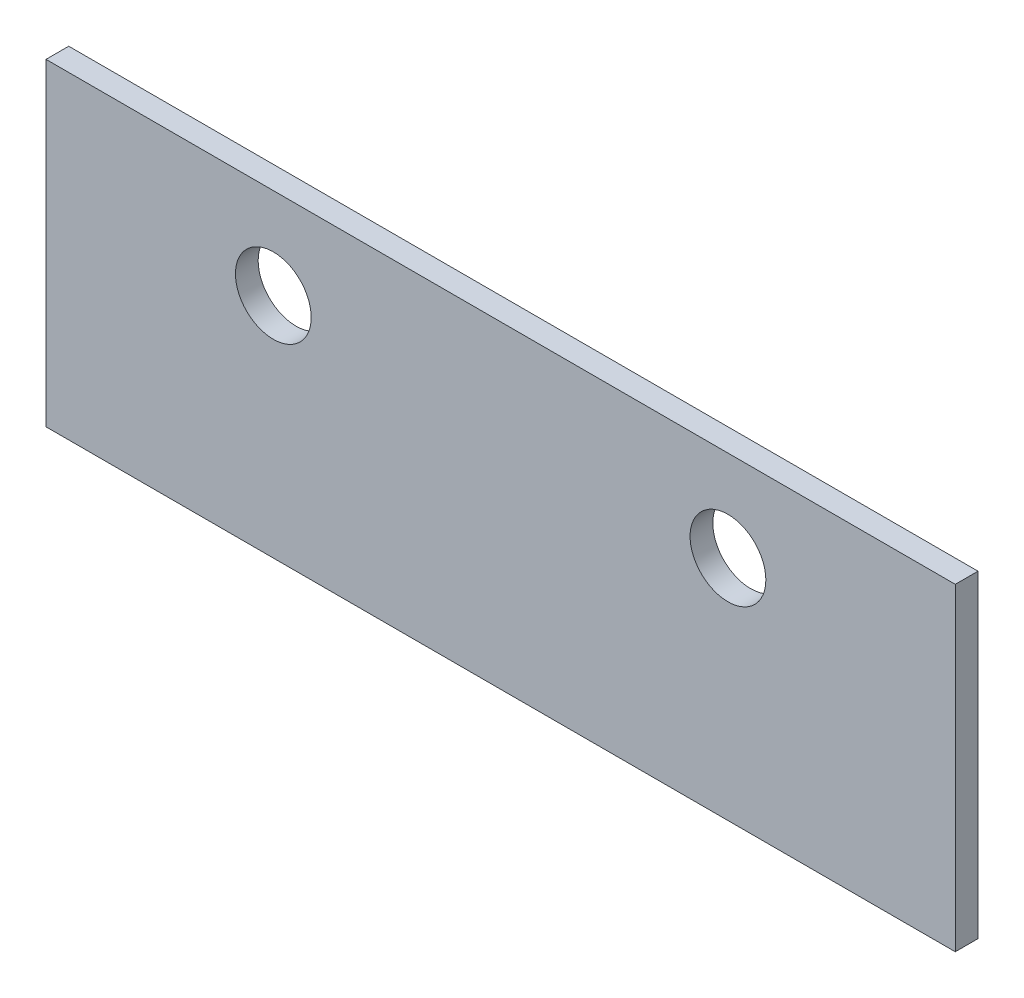
ISO-10303-21;
HEADER;
FILE_DESCRIPTION(('STEP AP214'),'2;1');
FILE_NAME('part.step','',(''),(''),'','','');
FILE_SCHEMA(('AUTOMOTIVE_DESIGN { 1 0 10303 214 1 1 1 1 }'));
ENDSEC;
DATA;
#1=APPLICATION_CONTEXT('core data for automotive mechanical design processes');
#2=APPLICATION_PROTOCOL_DEFINITION('international standard','automotive_design',2000,#1);
#3=PRODUCT_CONTEXT('',#1,'mechanical');
#4=PRODUCT('Part','Part','',(#3));
#5=PRODUCT_RELATED_PRODUCT_CATEGORY('part','',(#4));
#6=PRODUCT_DEFINITION_FORMATION('','',#4);
#7=PRODUCT_DEFINITION_CONTEXT('part definition',#1,'design');
#8=PRODUCT_DEFINITION('design','',#6,#7);
#9=PRODUCT_DEFINITION_SHAPE('','',#8);
#10=(LENGTH_UNIT() NAMED_UNIT(*) SI_UNIT(.MILLI.,.METRE.));
#11=(NAMED_UNIT(*) PLANE_ANGLE_UNIT() SI_UNIT($,.RADIAN.));
#12=(NAMED_UNIT(*) SI_UNIT($,.STERADIAN.) SOLID_ANGLE_UNIT());
#13=UNCERTAINTY_MEASURE_WITH_UNIT(LENGTH_MEASURE(1.E-05),#10,'distance_accuracy_value','');
#14=(GEOMETRIC_REPRESENTATION_CONTEXT(3) GLOBAL_UNCERTAINTY_ASSIGNED_CONTEXT((#13)) GLOBAL_UNIT_ASSIGNED_CONTEXT((#10,
#11,#12)) REPRESENTATION_CONTEXT('',''));
#15=CARTESIAN_POINT('',(0.,0.,0.));
#16=DIRECTION('',(0.,0.,1.));
#17=DIRECTION('',(1.,0.,0.));
#18=AXIS2_PLACEMENT_3D('',#15,#16,#17);
#19=CARTESIAN_POINT('',(-4.44089209850063E-13,-1.11022302462516E-13,1.5));
#20=DIRECTION('',(1.,0.,0.));
#21=DIRECTION('',(0.,0.,-1.));
#22=AXIS2_PLACEMENT_3D('',#19,#20,#21);
#23=PLANE('',#22);
#24=DIRECTION('',(0.,-1.,0.));
#25=VECTOR('',#24,1.);
#26=CARTESIAN_POINT('',(-4.44089209850063E-13,-1.11022302462516E-13,0.));
#27=LINE('',#26,#25);
#28=CARTESIAN_POINT('',(-4.44089209850063E-13,21.0000000000001,0.));
#29=VERTEX_POINT('',#28);
#30=CARTESIAN_POINT('',(-4.44089209850063E-13,-1.11022302462516E-13,0.));
#31=VERTEX_POINT('',#30);
#32=EDGE_CURVE('E77',#29,#31,#27,.T.);
#33=ORIENTED_EDGE('',*,*,#32,.T.);
#34=DIRECTION('',(0.,0.,-1.));
#35=VECTOR('',#34,1.);
#36=CARTESIAN_POINT('',(-4.44089209850063E-13,-1.11022302462516E-13,1.5));
#37=LINE('',#36,#35);
#38=CARTESIAN_POINT('',(-4.44089209850063E-13,-1.11022302462516E-13,1.5));
#39=VERTEX_POINT('',#38);
#40=EDGE_CURVE('E11',#39,#31,#37,.T.);
#41=ORIENTED_EDGE('',*,*,#40,.F.);
#42=DIRECTION('',(0.,-1.,0.));
#43=VECTOR('',#42,1.);
#44=CARTESIAN_POINT('',(-4.44089209850063E-13,-1.11022302462516E-13,1.5));
#45=LINE('',#44,#43);
#46=CARTESIAN_POINT('',(-4.44089209850063E-13,21.0000000000001,1.5));
#47=VERTEX_POINT('',#46);
#48=EDGE_CURVE('E100',#47,#39,#45,.T.);
#49=ORIENTED_EDGE('',*,*,#48,.F.);
#50=DIRECTION('',(0.,0.,-1.));
#51=VECTOR('',#50,1.);
#52=CARTESIAN_POINT('',(-4.44089209850063E-13,21.0000000000001,1.5));
#53=LINE('',#52,#51);
#54=EDGE_CURVE('E89',#47,#29,#53,.T.);
#55=ORIENTED_EDGE('',*,*,#54,.T.);
#56=EDGE_LOOP('',(#33,#41,#49,#55));
#57=FACE_BOUND('',#56,.T.);
#58=ADVANCED_FACE('F31',(#57),#23,.F.);
#59=CARTESIAN_POINT('',(-4.44089209850063E-13,-1.11022302462516E-13,1.5));
#60=DIRECTION('',(0.,1.,0.));
#61=DIRECTION('',(0.,0.,1.));
#62=AXIS2_PLACEMENT_3D('',#59,#60,#61);
#63=PLANE('',#62);
#64=DIRECTION('',(1.,0.,0.));
#65=VECTOR('',#64,1.);
#66=CARTESIAN_POINT('',(-4.44089209850063E-13,-1.11022302462516E-13,0.));
#67=LINE('',#66,#65);
#68=CARTESIAN_POINT('',(59.9999999999996,1.11022302462516E-13,0.));
#69=VERTEX_POINT('',#68);
#70=EDGE_CURVE('E73',#31,#69,#67,.T.);
#71=ORIENTED_EDGE('',*,*,#70,.T.);
#72=DIRECTION('',(0.,0.,-1.));
#73=VECTOR('',#72,1.);
#74=CARTESIAN_POINT('',(59.9999999999996,1.11022302462516E-13,1.5));
#75=LINE('',#74,#73);
#76=CARTESIAN_POINT('',(59.9999999999996,1.11022302462516E-13,1.5));
#77=VERTEX_POINT('',#76);
#78=EDGE_CURVE('E39',#77,#69,#75,.T.);
#79=ORIENTED_EDGE('',*,*,#78,.F.);
#80=DIRECTION('',(1.,0.,0.));
#81=VECTOR('',#80,1.);
#82=CARTESIAN_POINT('',(-4.44089209850063E-13,-1.11022302462516E-13,1.5));
#83=LINE('',#82,#81);
#84=EDGE_CURVE('E85',#39,#77,#83,.T.);
#85=ORIENTED_EDGE('',*,*,#84,.F.);
#86=ORIENTED_EDGE('',*,*,#40,.T.);
#87=EDGE_LOOP('',(#71,#79,#85,#86));
#88=FACE_BOUND('',#87,.T.);
#89=ADVANCED_FACE('F84',(#88),#63,.F.);
#90=CARTESIAN_POINT('',(59.9999999999996,1.11022302462516E-13,1.5));
#91=DIRECTION('',(-1.,0.,0.));
#92=DIRECTION('',(0.,0.,1.));
#93=AXIS2_PLACEMENT_3D('',#90,#91,#92);
#94=PLANE('',#93);
#95=DIRECTION('',(0.,1.,0.));
#96=VECTOR('',#95,1.);
#97=CARTESIAN_POINT('',(59.9999999999996,1.11022302462516E-13,0.));
#98=LINE('',#97,#96);
#99=CARTESIAN_POINT('',(60.0000000000001,21.0000000000002,1.11022302462516E-13));
#100=VERTEX_POINT('',#99);
#101=EDGE_CURVE('E78',#69,#100,#98,.T.);
#102=ORIENTED_EDGE('',*,*,#101,.T.);
#103=DIRECTION('',(0.,0.,-1.));
#104=VECTOR('',#103,1.);
#105=CARTESIAN_POINT('',(60.0000000000001,21.0000000000002,1.50000000000011));
#106=LINE('',#105,#104);
#107=CARTESIAN_POINT('',(60.0000000000001,21.0000000000002,1.50000000000011));
#108=VERTEX_POINT('',#107);
#109=EDGE_CURVE('E106',#108,#100,#106,.T.);
#110=ORIENTED_EDGE('',*,*,#109,.F.);
#111=DIRECTION('',(0.,1.,0.));
#112=VECTOR('',#111,1.);
#113=CARTESIAN_POINT('',(59.9999999999996,1.11022302462516E-13,1.5));
#114=LINE('',#113,#112);
#115=EDGE_CURVE('E52',#77,#108,#114,.T.);
#116=ORIENTED_EDGE('',*,*,#115,.F.);
#117=ORIENTED_EDGE('',*,*,#78,.T.);
#118=EDGE_LOOP('',(#102,#110,#116,#117));
#119=FACE_BOUND('',#118,.T.);
#120=ADVANCED_FACE('F110',(#119),#94,.F.);
#121=CARTESIAN_POINT('',(-4.44089209850063E-13,21.0000000000001,1.5));
#122=DIRECTION('',(0.,-1.,0.));
#123=DIRECTION('',(0.,0.,-1.));
#124=AXIS2_PLACEMENT_3D('',#121,#122,#123);
#125=PLANE('',#124);
#126=DIRECTION('',(-1.,0.,0.));
#127=VECTOR('',#126,1.);
#128=CARTESIAN_POINT('',(-4.44089209850063E-13,21.0000000000001,0.));
#129=LINE('',#128,#127);
#130=EDGE_CURVE('E98',#100,#29,#129,.T.);
#131=ORIENTED_EDGE('',*,*,#130,.T.);
#132=ORIENTED_EDGE('',*,*,#54,.F.);
#133=DIRECTION('',(-1.,0.,0.));
#134=VECTOR('',#133,1.);
#135=CARTESIAN_POINT('',(-4.44089209850063E-13,21.0000000000001,1.5));
#136=LINE('',#135,#134);
#137=EDGE_CURVE('E47',#108,#47,#136,.T.);
#138=ORIENTED_EDGE('',*,*,#137,.F.);
#139=ORIENTED_EDGE('',*,*,#109,.T.);
#140=EDGE_LOOP('',(#131,#132,#138,#139));
#141=FACE_BOUND('',#140,.T.);
#142=ADVANCED_FACE('F112',(#141),#125,.F.);
#143=CARTESIAN_POINT('',(-4.44089209850063E-13,21.0000000000001,1.5));
#144=DIRECTION('',(0.,0.,-1.));
#145=DIRECTION('',(-1.,0.,0.));
#146=AXIS2_PLACEMENT_3D('',#143,#144,#145);
#147=PLANE('',#146);
#148=CARTESIAN_POINT('',(44.9999999999999,14.9999999999999,1.50000000000011));
#149=DIRECTION('',(0.,0.,1.));
#150=DIRECTION('',(1.,0.,0.));
#151=AXIS2_PLACEMENT_3D('',#148,#149,#150);
#152=CIRCLE('',#151,2.5);
#153=CARTESIAN_POINT('',(47.4999999999999,14.9999999999999,1.50000000000011));
#154=VERTEX_POINT('',#153);
#155=EDGE_CURVE('E179',#154,#154,#152,.T.);
#156=ORIENTED_EDGE('',*,*,#155,.F.);
#157=EDGE_LOOP('',(#156));
#158=FACE_BOUND('',#157,.T.);
#159=CARTESIAN_POINT('',(14.9999999999992,15.,1.5));
#160=DIRECTION('',(0.,0.,1.));
#161=DIRECTION('',(1.,0.,0.));
#162=AXIS2_PLACEMENT_3D('',#159,#160,#161);
#163=CIRCLE('',#162,2.5);
#164=CARTESIAN_POINT('',(17.4999999999992,15.,1.5));
#165=VERTEX_POINT('',#164);
#166=EDGE_CURVE('E93',#165,#165,#163,.T.);
#167=ORIENTED_EDGE('',*,*,#166,.F.);
#168=EDGE_LOOP('',(#167));
#169=FACE_BOUND('',#168,.T.);
#170=ORIENTED_EDGE('',*,*,#48,.T.);
#171=ORIENTED_EDGE('',*,*,#84,.T.);
#172=ORIENTED_EDGE('',*,*,#115,.T.);
#173=ORIENTED_EDGE('',*,*,#137,.T.);
#174=EDGE_LOOP('',(#170,#171,#172,#173));
#175=FACE_BOUND('',#174,.T.);
#176=ADVANCED_FACE('F113',(#158,#169,#175),#147,.F.);
#177=CARTESIAN_POINT('',(-4.44089209850063E-13,21.0000000000001,0.));
#178=DIRECTION('',(0.,0.,-1.));
#179=DIRECTION('',(-1.,0.,0.));
#180=AXIS2_PLACEMENT_3D('',#177,#178,#179);
#181=PLANE('',#180);
#182=CARTESIAN_POINT('',(44.9999999999999,14.9999999999999,1.11022302462516E-13));
#183=DIRECTION('',(0.,0.,-1.));
#184=DIRECTION('',(-1.,0.,0.));
#185=AXIS2_PLACEMENT_3D('',#182,#183,#184);
#186=CIRCLE('',#185,2.5);
#187=CARTESIAN_POINT('',(42.4999999999999,14.9999999999999,1.11022302462516E-13));
#188=VERTEX_POINT('',#187);
#189=EDGE_CURVE('E34',#188,#188,#186,.T.);
#190=ORIENTED_EDGE('',*,*,#189,.F.);
#191=EDGE_LOOP('',(#190));
#192=FACE_BOUND('',#191,.T.);
#193=CARTESIAN_POINT('',(14.9999999999992,15.,0.));
#194=DIRECTION('',(0.,0.,-1.));
#195=DIRECTION('',(-1.,0.,0.));
#196=AXIS2_PLACEMENT_3D('',#193,#194,#195);
#197=CIRCLE('',#196,2.5);
#198=CARTESIAN_POINT('',(12.4999999999992,15.,0.));
#199=VERTEX_POINT('',#198);
#200=EDGE_CURVE('E90',#199,#199,#197,.T.);
#201=ORIENTED_EDGE('',*,*,#200,.F.);
#202=EDGE_LOOP('',(#201));
#203=FACE_BOUND('',#202,.T.);
#204=ORIENTED_EDGE('',*,*,#32,.F.);
#205=ORIENTED_EDGE('',*,*,#130,.F.);
#206=ORIENTED_EDGE('',*,*,#101,.F.);
#207=ORIENTED_EDGE('',*,*,#70,.F.);
#208=EDGE_LOOP('',(#204,#205,#206,#207));
#209=FACE_BOUND('',#208,.T.);
#210=ADVANCED_FACE('F74',(#192,#203,#209),#181,.T.);
#211=CARTESIAN_POINT('',(14.9999999999992,15.,-0.5));
#212=DIRECTION('',(0.,0.,1.));
#213=DIRECTION('',(1.,0.,0.));
#214=AXIS2_PLACEMENT_3D('',#211,#212,#213);
#215=CYLINDRICAL_SURFACE('',#214,2.5);
#216=ORIENTED_EDGE('',*,*,#200,.T.);
#217=EDGE_LOOP('',(#216));
#218=FACE_BOUND('',#217,.T.);
#219=ORIENTED_EDGE('',*,*,#166,.T.);
#220=EDGE_LOOP('',(#219));
#221=FACE_BOUND('',#220,.T.);
#222=ADVANCED_FACE('F121',(#218,#221),#215,.F.);
#223=CARTESIAN_POINT('',(44.9999999999999,14.9999999999999,-0.499999999999889));
#224=DIRECTION('',(0.,0.,1.));
#225=DIRECTION('',(1.,0.,0.));
#226=AXIS2_PLACEMENT_3D('',#223,#224,#225);
#227=CYLINDRICAL_SURFACE('',#226,2.5);
#228=ORIENTED_EDGE('',*,*,#189,.T.);
#229=EDGE_LOOP('',(#228));
#230=FACE_BOUND('',#229,.T.);
#231=ORIENTED_EDGE('',*,*,#155,.T.);
#232=EDGE_LOOP('',(#231));
#233=FACE_BOUND('',#232,.T.);
#234=ADVANCED_FACE('F161',(#230,#233),#227,.F.);
#235=CLOSED_SHELL('',(#58,#89,#120,#142,#176,#210,#222,#234));
#236=MANIFOLD_SOLID_BREP('B2',#235);
#237=ADVANCED_BREP_SHAPE_REPRESENTATION('',(#18,#236),#14);
#238=SHAPE_DEFINITION_REPRESENTATION(#9,#237);
ENDSEC;
END-ISO-10303-21;
